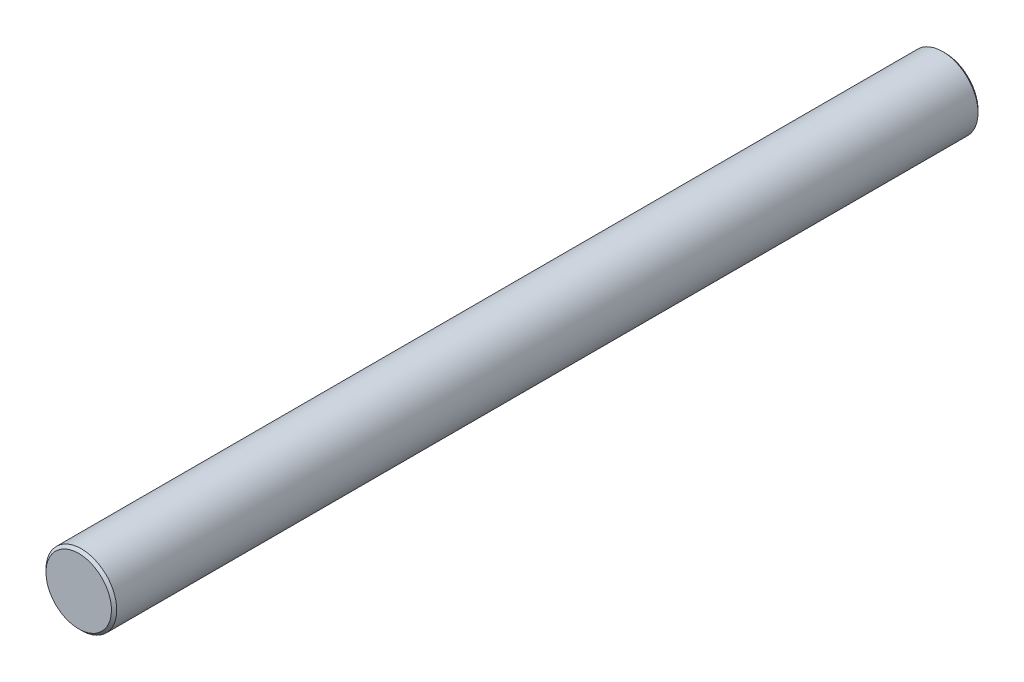
ISO-10303-21;
HEADER;
FILE_DESCRIPTION(('STEP AP214'),'2;1');
FILE_NAME('part.step','',(''),(''),'','','');
FILE_SCHEMA(('AUTOMOTIVE_DESIGN { 1 0 10303 214 1 1 1 1 }'));
ENDSEC;
DATA;
#1=APPLICATION_CONTEXT('core data for automotive mechanical design processes');
#2=APPLICATION_PROTOCOL_DEFINITION('international standard','automotive_design',2000,#1);
#3=PRODUCT_CONTEXT('',#1,'mechanical');
#4=PRODUCT('Part','Part','',(#3));
#5=PRODUCT_RELATED_PRODUCT_CATEGORY('part','',(#4));
#6=PRODUCT_DEFINITION_FORMATION('','',#4);
#7=PRODUCT_DEFINITION_CONTEXT('part definition',#1,'design');
#8=PRODUCT_DEFINITION('design','',#6,#7);
#9=PRODUCT_DEFINITION_SHAPE('','',#8);
#10=(LENGTH_UNIT() NAMED_UNIT(*) SI_UNIT(.MILLI.,.METRE.));
#11=(NAMED_UNIT(*) PLANE_ANGLE_UNIT() SI_UNIT($,.RADIAN.));
#12=(NAMED_UNIT(*) SI_UNIT($,.STERADIAN.) SOLID_ANGLE_UNIT());
#13=UNCERTAINTY_MEASURE_WITH_UNIT(LENGTH_MEASURE(1.E-05),#10,'distance_accuracy_value','');
#14=(GEOMETRIC_REPRESENTATION_CONTEXT(3) GLOBAL_UNCERTAINTY_ASSIGNED_CONTEXT((#13)) GLOBAL_UNIT_ASSIGNED_CONTEXT((#10,
#11,#12)) REPRESENTATION_CONTEXT('',''));
#15=CARTESIAN_POINT('',(0.,0.,0.));
#16=DIRECTION('',(0.,0.,1.));
#17=DIRECTION('',(1.,0.,0.));
#18=AXIS2_PLACEMENT_3D('',#15,#16,#17);
#19=CARTESIAN_POINT('',(0.,9.25,0.));
#20=DIRECTION('',(0.,0.,-1.));
#21=DIRECTION('',(0.,1.,0.));
#22=AXIS2_PLACEMENT_3D('',#19,#20,#21);
#23=PLANE('',#22);
#24=CARTESIAN_POINT('',(0.,0.,0.));
#25=DIRECTION('',(0.,0.,-1.));
#26=DIRECTION('',(0.,1.,0.));
#27=AXIS2_PLACEMENT_3D('',#24,#25,#26);
#28=CIRCLE('',#27,18.5);
#29=CARTESIAN_POINT('',(0.,18.5,0.));
#30=VERTEX_POINT('',#29);
#31=EDGE_CURVE('E9',#30,#30,#28,.T.);
#32=ORIENTED_EDGE('',*,*,#31,.T.);
#33=EDGE_LOOP('',(#32));
#34=FACE_BOUND('',#33,.T.);
#35=CARTESIAN_POINT('',(0.,0.,0.));
#36=DIRECTION('',(0.,0.,1.));
#37=DIRECTION('',(-1.,0.,0.));
#38=AXIS2_PLACEMENT_3D('',#35,#36,#37);
#39=CIRCLE('',#38,6.);
#40=CARTESIAN_POINT('',(-6.,0.,0.));
#41=VERTEX_POINT('',#40);
#42=EDGE_CURVE('E52',#41,#41,#39,.T.);
#43=ORIENTED_EDGE('',*,*,#42,.T.);
#44=EDGE_LOOP('',(#43));
#45=FACE_BOUND('',#44,.T.);
#46=ADVANCED_FACE('F15',(#34,#45),#23,.T.);
#47=CARTESIAN_POINT('',(0.,0.,0.75));
#48=DIRECTION('',(0.,0.,1.));
#49=DIRECTION('',(0.,1.,0.));
#50=AXIS2_PLACEMENT_3D('',#47,#48,#49);
#51=CONICAL_SURFACE('',#50,19.25,0.785398163397448);
#52=CARTESIAN_POINT('',(0.,0.,1.5));
#53=DIRECTION('',(0.,0.,-1.));
#54=DIRECTION('',(0.,1.,0.));
#55=AXIS2_PLACEMENT_3D('',#52,#53,#54);
#56=CIRCLE('',#55,20.);
#57=CARTESIAN_POINT('',(0.,20.,1.5));
#58=VERTEX_POINT('',#57);
#59=EDGE_CURVE('E25',#58,#58,#56,.T.);
#60=ORIENTED_EDGE('',*,*,#59,.T.);
#61=EDGE_LOOP('',(#60));
#62=FACE_BOUND('',#61,.T.);
#63=ORIENTED_EDGE('',*,*,#31,.F.);
#64=EDGE_LOOP('',(#63));
#65=FACE_BOUND('',#64,.T.);
#66=ADVANCED_FACE('F121',(#62,#65),#51,.T.);
#67=CARTESIAN_POINT('',(0.,0.,245.));
#68=DIRECTION('',(0.,0.,1.));
#69=DIRECTION('',(0.,1.,0.));
#70=AXIS2_PLACEMENT_3D('',#67,#68,#69);
#71=CYLINDRICAL_SURFACE('',#70,20.);
#72=CARTESIAN_POINT('',(0.,0.,488.5));
#73=DIRECTION('',(0.,0.,-1.));
#74=DIRECTION('',(0.,1.,0.));
#75=AXIS2_PLACEMENT_3D('',#72,#73,#74);
#76=CIRCLE('',#75,20.);
#77=CARTESIAN_POINT('',(0.,20.,488.5));
#78=VERTEX_POINT('',#77);
#79=EDGE_CURVE('E19',#78,#78,#76,.T.);
#80=ORIENTED_EDGE('',*,*,#79,.T.);
#81=EDGE_LOOP('',(#80));
#82=FACE_BOUND('',#81,.T.);
#83=ORIENTED_EDGE('',*,*,#59,.F.);
#84=EDGE_LOOP('',(#83));
#85=FACE_BOUND('',#84,.T.);
#86=CARTESIAN_POINT('',(0.,0.,6.5));
#87=DIRECTION('',(0.,0.,-1.));
#88=DIRECTION('',(0.,1.,0.));
#89=AXIS2_PLACEMENT_3D('',#86,#87,#88);
#90=CIRCLE('',#89,20.);
#91=CARTESIAN_POINT('',(10.5356537528527,-17.,6.5));
#92=VERTEX_POINT('',#91);
#93=CARTESIAN_POINT('',(-10.5356537528527,-17.,6.5));
#94=VERTEX_POINT('',#93);
#95=EDGE_CURVE('E69',#92,#94,#90,.T.);
#96=ORIENTED_EDGE('',*,*,#95,.T.);
#97=DIRECTION('',(0.,0.,1.));
#98=VECTOR('',#97,1.);
#99=CARTESIAN_POINT('',(-10.5356537528527,-17.,8.25));
#100=LINE('',#99,#98);
#101=CARTESIAN_POINT('',(-10.5356537528527,-17.,10.));
#102=VERTEX_POINT('',#101);
#103=EDGE_CURVE('E62',#94,#102,#100,.T.);
#104=ORIENTED_EDGE('',*,*,#103,.T.);
#105=CARTESIAN_POINT('',(0.,0.,10.));
#106=DIRECTION('',(0.,0.,1.));
#107=DIRECTION('',(0.,1.,0.));
#108=AXIS2_PLACEMENT_3D('',#105,#106,#107);
#109=CIRCLE('',#108,20.);
#110=CARTESIAN_POINT('',(10.5356537528527,-17.,10.));
#111=VERTEX_POINT('',#110);
#112=EDGE_CURVE('E75',#102,#111,#109,.T.);
#113=ORIENTED_EDGE('',*,*,#112,.T.);
#114=DIRECTION('',(0.,0.,-1.));
#115=VECTOR('',#114,1.);
#116=CARTESIAN_POINT('',(10.5356537528527,-17.,8.25));
#117=LINE('',#116,#115);
#118=EDGE_CURVE('E60',#111,#92,#117,.T.);
#119=ORIENTED_EDGE('',*,*,#118,.T.);
#120=EDGE_LOOP('',(#96,#104,#113,#119));
#121=FACE_BOUND('',#120,.T.);
#122=ADVANCED_FACE('F17',(#82,#85,#121),#71,.T.);
#123=CARTESIAN_POINT('',(0.,0.,489.25));
#124=DIRECTION('',(0.,0.,-1.));
#125=DIRECTION('',(0.,1.,0.));
#126=AXIS2_PLACEMENT_3D('',#123,#124,#125);
#127=CONICAL_SURFACE('',#126,19.25,0.785398163397448);
#128=CARTESIAN_POINT('',(0.,0.,490.));
#129=DIRECTION('',(0.,0.,-1.));
#130=DIRECTION('',(0.,1.,0.));
#131=AXIS2_PLACEMENT_3D('',#128,#129,#130);
#132=CIRCLE('',#131,18.5);
#133=CARTESIAN_POINT('',(0.,18.5,490.));
#134=VERTEX_POINT('',#133);
#135=EDGE_CURVE('E44',#134,#134,#132,.T.);
#136=ORIENTED_EDGE('',*,*,#135,.T.);
#137=EDGE_LOOP('',(#136));
#138=FACE_BOUND('',#137,.T.);
#139=ORIENTED_EDGE('',*,*,#79,.F.);
#140=EDGE_LOOP('',(#139));
#141=FACE_BOUND('',#140,.T.);
#142=ADVANCED_FACE('F116',(#138,#141),#127,.T.);
#143=CARTESIAN_POINT('',(0.,9.25,490.));
#144=DIRECTION('',(0.,0.,1.));
#145=DIRECTION('',(0.,-1.,0.));
#146=AXIS2_PLACEMENT_3D('',#143,#144,#145);
#147=PLANE('',#146);
#148=ORIENTED_EDGE('',*,*,#135,.F.);
#149=EDGE_LOOP('',(#148));
#150=FACE_BOUND('',#149,.T.);
#151=ADVANCED_FACE('F110',(#150),#147,.T.);
#152=CARTESIAN_POINT('',(0.,0.,26.4586213285198));
#153=DIRECTION('',(0.,0.,-1.));
#154=DIRECTION('',(-1.,0.,0.));
#155=AXIS2_PLACEMENT_3D('',#152,#153,#154);
#156=CONICAL_SURFACE('',#155,2.52640625,1.0471975511966);
#157=CARTESIAN_POINT('',(0.,0.,25.));
#158=DIRECTION('',(0.,0.,1.));
#159=DIRECTION('',(-1.,0.,0.));
#160=AXIS2_PLACEMENT_3D('',#157,#158,#159);
#161=CIRCLE('',#160,5.0528125);
#162=CARTESIAN_POINT('',(-5.0528125,0.,25.));
#163=VERTEX_POINT('',#162);
#164=EDGE_CURVE('E51',#163,#163,#161,.T.);
#165=ORIENTED_EDGE('',*,*,#164,.F.);
#166=EDGE_LOOP('',(#165));
#167=FACE_BOUND('',#166,.T.);
#168=CARTESIAN_POINT('',(0.,0.,27.9172426570397));
#169=VERTEX_POINT('',#168);
#170=VERTEX_LOOP('',#169);
#171=FACE_BOUND('',#170,.T.);
#172=ADVANCED_FACE('F104',(#167,#171),#156,.F.);
#173=CARTESIAN_POINT('',(0.,0.,12.97359375));
#174=DIRECTION('',(0.,0.,-1.));
#175=DIRECTION('',(-1.,0.,0.));
#176=AXIS2_PLACEMENT_3D('',#173,#174,#175);
#177=CYLINDRICAL_SURFACE('',#176,5.0528125);
#178=CARTESIAN_POINT('',(0.,0.,0.9471875));
#179=DIRECTION('',(0.,0.,1.));
#180=DIRECTION('',(-1.,0.,0.));
#181=AXIS2_PLACEMENT_3D('',#178,#179,#180);
#182=CIRCLE('',#181,5.0528125);
#183=CARTESIAN_POINT('',(-5.0528125,0.,0.9471875));
#184=VERTEX_POINT('',#183);
#185=EDGE_CURVE('E57',#184,#184,#182,.T.);
#186=ORIENTED_EDGE('',*,*,#185,.F.);
#187=EDGE_LOOP('',(#186));
#188=FACE_BOUND('',#187,.T.);
#189=ORIENTED_EDGE('',*,*,#164,.T.);
#190=EDGE_LOOP('',(#189));
#191=FACE_BOUND('',#190,.T.);
#192=ADVANCED_FACE('F101',(#188,#191),#177,.F.);
#193=CARTESIAN_POINT('',(0.,0.,0.47359375));
#194=DIRECTION('',(0.,0.,-1.));
#195=DIRECTION('',(-1.,0.,0.));
#196=AXIS2_PLACEMENT_3D('',#193,#194,#195);
#197=CONICAL_SURFACE('',#196,5.52640625,0.785398163397448);
#198=ORIENTED_EDGE('',*,*,#42,.F.);
#199=EDGE_LOOP('',(#198));
#200=FACE_BOUND('',#199,.T.);
#201=ORIENTED_EDGE('',*,*,#185,.T.);
#202=EDGE_LOOP('',(#201));
#203=FACE_BOUND('',#202,.T.);
#204=ADVANCED_FACE('F99',(#200,#203),#197,.F.);
#205=CARTESIAN_POINT('',(0.,-17.,8.25));
#206=DIRECTION('',(0.,-1.,0.));
#207=DIRECTION('',(0.,0.,-1.));
#208=AXIS2_PLACEMENT_3D('',#205,#206,#207);
#209=PLANE('',#208);
#210=ORIENTED_EDGE('',*,*,#103,.F.);
#211=DIRECTION('',(1.,0.,0.));
#212=VECTOR('',#211,1.);
#213=CARTESIAN_POINT('',(0.,-17.,6.5));
#214=LINE('',#213,#212);
#215=EDGE_CURVE('E66',#94,#92,#214,.T.);
#216=ORIENTED_EDGE('',*,*,#215,.T.);
#217=ORIENTED_EDGE('',*,*,#118,.F.);
#218=DIRECTION('',(-1.,0.,0.));
#219=VECTOR('',#218,1.);
#220=CARTESIAN_POINT('',(0.,-17.,10.));
#221=LINE('',#220,#219);
#222=EDGE_CURVE('E72',#111,#102,#221,.T.);
#223=ORIENTED_EDGE('',*,*,#222,.T.);
#224=EDGE_LOOP('',(#210,#216,#217,#223));
#225=FACE_BOUND('',#224,.T.);
#226=ADVANCED_FACE('F131',(#225),#209,.T.);
#227=CARTESIAN_POINT('',(0.,-19.5,6.5));
#228=DIRECTION('',(0.,0.,1.));
#229=DIRECTION('',(1.,0.,0.));
#230=AXIS2_PLACEMENT_3D('',#227,#228,#229);
#231=PLANE('',#230);
#232=ORIENTED_EDGE('',*,*,#95,.F.);
#233=ORIENTED_EDGE('',*,*,#215,.F.);
#234=EDGE_LOOP('',(#232,#233));
#235=FACE_BOUND('',#234,.T.);
#236=ADVANCED_FACE('F135',(#235),#231,.T.);
#237=CARTESIAN_POINT('',(0.,-19.5,10.));
#238=DIRECTION('',(0.,0.,1.));
#239=DIRECTION('',(1.,0.,0.));
#240=AXIS2_PLACEMENT_3D('',#237,#238,#239);
#241=PLANE('',#240);
#242=ORIENTED_EDGE('',*,*,#112,.F.);
#243=ORIENTED_EDGE('',*,*,#222,.F.);
#244=EDGE_LOOP('',(#242,#243));
#245=FACE_BOUND('',#244,.T.);
#246=ADVANCED_FACE('F87',(#245),#241,.F.);
#247=CLOSED_SHELL('',(#46,#66,#122,#142,#151,#172,#192,#204,#226,#236,#246));
#248=MANIFOLD_SOLID_BREP('B1',#247);
#249=ADVANCED_BREP_SHAPE_REPRESENTATION('',(#18,#248),#14);
#250=SHAPE_DEFINITION_REPRESENTATION(#9,#249);
ENDSEC;
END-ISO-10303-21;
